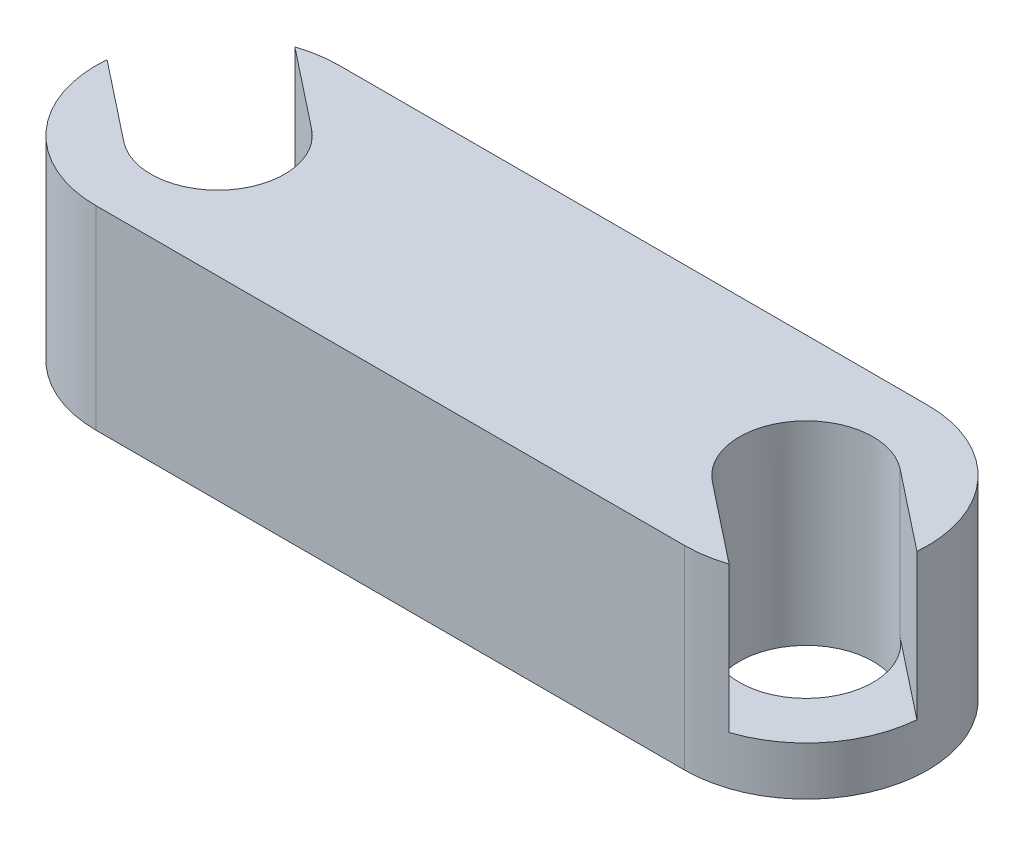
ISO-10303-21;
HEADER;
FILE_DESCRIPTION(('STEP AP214'),'2;1');
FILE_NAME('part.step','',(''),(''),'','','');
FILE_SCHEMA(('AUTOMOTIVE_DESIGN { 1 0 10303 214 1 1 1 1 }'));
ENDSEC;
DATA;
#1=APPLICATION_CONTEXT('core data for automotive mechanical design processes');
#2=APPLICATION_PROTOCOL_DEFINITION('international standard','automotive_design',2000,#1);
#3=PRODUCT_CONTEXT('',#1,'mechanical');
#4=PRODUCT('Part','Part','',(#3));
#5=PRODUCT_RELATED_PRODUCT_CATEGORY('part','',(#4));
#6=PRODUCT_DEFINITION_FORMATION('','',#4);
#7=PRODUCT_DEFINITION_CONTEXT('part definition',#1,'design');
#8=PRODUCT_DEFINITION('design','',#6,#7);
#9=PRODUCT_DEFINITION_SHAPE('','',#8);
#10=(LENGTH_UNIT() NAMED_UNIT(*) SI_UNIT(.MILLI.,.METRE.));
#11=(NAMED_UNIT(*) PLANE_ANGLE_UNIT() SI_UNIT($,.RADIAN.));
#12=(NAMED_UNIT(*) SI_UNIT($,.STERADIAN.) SOLID_ANGLE_UNIT());
#13=UNCERTAINTY_MEASURE_WITH_UNIT(LENGTH_MEASURE(1.E-05),#10,'distance_accuracy_value','');
#14=(GEOMETRIC_REPRESENTATION_CONTEXT(3) GLOBAL_UNCERTAINTY_ASSIGNED_CONTEXT((#13)) GLOBAL_UNIT_ASSIGNED_CONTEXT((#10,
#11,#12)) REPRESENTATION_CONTEXT('',''));
#15=CARTESIAN_POINT('',(0.,0.,0.));
#16=DIRECTION('',(0.,0.,1.));
#17=DIRECTION('',(1.,0.,0.));
#18=AXIS2_PLACEMENT_3D('',#15,#16,#17);
#19=CARTESIAN_POINT('',(-7.71252727608147,8.,-1.5));
#20=DIRECTION('',(0.,1.,0.));
#21=DIRECTION('',(0.,0.,1.));
#22=AXIS2_PLACEMENT_3D('',#19,#20,#21);
#23=PLANE('',#22);
#24=DIRECTION('',(0.784882765557683,0.,0.619644288548296));
#25=VECTOR('',#24,1.);
#26=CARTESIAN_POINT('',(-9.41654906958926,8.,0.658427605283628));
#27=LINE('',#26,#25);
#28=CARTESIAN_POINT('',(-12.6940807878929,8.,-1.92909743527416));
#29=VERTEX_POINT('',#28);
#30=CARTESIAN_POINT('',(-9.41654906958926,8.,0.658427605283628));
#31=VERTEX_POINT('',#30);
#32=EDGE_CURVE('E179',#29,#31,#27,.T.);
#33=ORIENTED_EDGE('',*,*,#32,.F.);
#34=CARTESIAN_POINT('',(-7.71252727608147,8.,-1.5));
#35=DIRECTION('',(0.,1.,0.));
#36=DIRECTION('',(0.,0.,1.));
#37=AXIS2_PLACEMENT_3D('',#34,#35,#36);
#38=CIRCLE('',#37,5.);
#39=CARTESIAN_POINT('',(-7.71252727608147,8.,3.5));
#40=VERTEX_POINT('',#39);
#41=EDGE_CURVE('E218',#29,#40,#38,.T.);
#42=ORIENTED_EDGE('',*,*,#41,.T.);
#43=DIRECTION('',(1.,0.,0.));
#44=VECTOR('',#43,1.);
#45=CARTESIAN_POINT('',(-7.71252727608147,8.,3.5));
#46=LINE('',#45,#44);
#47=CARTESIAN_POINT('',(16.4949095939185,8.,3.5));
#48=VERTEX_POINT('',#47);
#49=EDGE_CURVE('E217',#40,#48,#46,.T.);
#50=ORIENTED_EDGE('',*,*,#49,.T.);
#51=CARTESIAN_POINT('',(16.4949095939185,8.,-1.5));
#52=DIRECTION('',(0.,1.,0.));
#53=DIRECTION('',(0.,0.,1.));
#54=AXIS2_PLACEMENT_3D('',#51,#52,#53);
#55=CIRCLE('',#54,5.);
#56=CARTESIAN_POINT('',(18.0684195187144,8.,3.2459526458414));
#57=VERTEX_POINT('',#56);
#58=EDGE_CURVE('E222',#48,#57,#55,.T.);
#59=ORIENTED_EDGE('',*,*,#58,.T.);
#60=DIRECTION('',(0.784882765557684,0.,0.619644288548295));
#61=VECTOR('',#60,1.);
#62=CARTESIAN_POINT('',(14.7908878004107,8.,0.658427605283642));
#63=LINE('',#62,#61);
#64=CARTESIAN_POINT('',(14.7908878004107,8.,0.658427605283642));
#65=VERTEX_POINT('',#64);
#66=EDGE_CURVE('E167',#65,#57,#63,.T.);
#67=ORIENTED_EDGE('',*,*,#66,.F.);
#68=CARTESIAN_POINT('',(16.4949095939185,8.,-1.5));
#69=DIRECTION('',(0.,1.,0.));
#70=DIRECTION('',(0.,0.,1.));
#71=AXIS2_PLACEMENT_3D('',#68,#69,#70);
#72=CIRCLE('',#71,2.75);
#73=CARTESIAN_POINT('',(18.1989313874263,8.,-3.65842760528363));
#74=VERTEX_POINT('',#73);
#75=EDGE_CURVE('E199',#74,#65,#72,.T.);
#76=ORIENTED_EDGE('',*,*,#75,.F.);
#77=DIRECTION('',(-0.784882765557683,0.,-0.619644288548295));
#78=VECTOR('',#77,1.);
#79=CARTESIAN_POINT('',(18.1989313874263,8.,-3.65842760528363));
#80=LINE('',#79,#78);
#81=CARTESIAN_POINT('',(21.47646310573,8.,-1.07090256472586));
#82=VERTEX_POINT('',#81);
#83=EDGE_CURVE('E171',#82,#74,#80,.T.);
#84=ORIENTED_EDGE('',*,*,#83,.F.);
#85=CARTESIAN_POINT('',(16.4949095939185,8.,-6.5));
#86=VERTEX_POINT('',#85);
#87=EDGE_CURVE('E221',#82,#86,#55,.T.);
#88=ORIENTED_EDGE('',*,*,#87,.T.);
#89=DIRECTION('',(-1.,0.,0.));
#90=VECTOR('',#89,1.);
#91=CARTESIAN_POINT('',(-7.71252727608147,8.,-6.5));
#92=LINE('',#91,#90);
#93=CARTESIAN_POINT('',(-7.71252727608147,8.,-6.5));
#94=VERTEX_POINT('',#93);
#95=EDGE_CURVE('E226',#86,#94,#92,.T.);
#96=ORIENTED_EDGE('',*,*,#95,.T.);
#97=CARTESIAN_POINT('',(-9.28603720087728,8.,-6.24595264584141));
#98=VERTEX_POINT('',#97);
#99=EDGE_CURVE('E213',#94,#98,#38,.T.);
#100=ORIENTED_EDGE('',*,*,#99,.T.);
#101=DIRECTION('',(-0.784882765557683,0.,-0.619644288548295));
#102=VECTOR('',#101,1.);
#103=CARTESIAN_POINT('',(-6.00850548257363,8.,-3.65842760528364));
#104=LINE('',#103,#102);
#105=CARTESIAN_POINT('',(-6.00850548257363,8.,-3.65842760528364));
#106=VERTEX_POINT('',#105);
#107=EDGE_CURVE('E160',#106,#98,#104,.T.);
#108=ORIENTED_EDGE('',*,*,#107,.F.);
#109=CARTESIAN_POINT('',(-7.71252727608147,8.,-1.5));
#110=DIRECTION('',(0.,1.,0.));
#111=DIRECTION('',(0.,0.,1.));
#112=AXIS2_PLACEMENT_3D('',#109,#110,#111);
#113=CIRCLE('',#112,2.75);
#114=EDGE_CURVE('E149',#31,#106,#113,.T.);
#115=ORIENTED_EDGE('',*,*,#114,.F.);
#116=EDGE_LOOP('',(#33,#42,#50,#59,#67,#76,#84,#88,#96,#100,#108,#115));
#117=FACE_BOUND('',#116,.T.);
#118=ADVANCED_FACE('F39',(#117),#23,.T.);
#119=CARTESIAN_POINT('',(-7.71252727608147,0.,-1.5));
#120=DIRECTION('',(0.,1.,0.));
#121=DIRECTION('',(0.,0.,1.));
#122=AXIS2_PLACEMENT_3D('',#119,#120,#121);
#123=PLANE('',#122);
#124=CARTESIAN_POINT('',(-7.71252727608147,0.,-1.5));
#125=DIRECTION('',(0.,1.,0.));
#126=DIRECTION('',(0.,0.,1.));
#127=AXIS2_PLACEMENT_3D('',#124,#125,#126);
#128=CIRCLE('',#127,5.);
#129=CARTESIAN_POINT('',(-7.71252727608147,0.,-6.5));
#130=VERTEX_POINT('',#129);
#131=CARTESIAN_POINT('',(-7.71252727608147,0.,3.5));
#132=VERTEX_POINT('',#131);
#133=EDGE_CURVE('E209',#130,#132,#128,.T.);
#134=ORIENTED_EDGE('',*,*,#133,.F.);
#135=DIRECTION('',(-1.,0.,0.));
#136=VECTOR('',#135,1.);
#137=CARTESIAN_POINT('',(-7.71252727608147,0.,-6.5));
#138=LINE('',#137,#136);
#139=CARTESIAN_POINT('',(16.4949095939185,0.,-6.5));
#140=VERTEX_POINT('',#139);
#141=EDGE_CURVE('E239',#140,#130,#138,.T.);
#142=ORIENTED_EDGE('',*,*,#141,.F.);
#143=CARTESIAN_POINT('',(16.4949095939185,0.,-1.5));
#144=DIRECTION('',(0.,1.,0.));
#145=DIRECTION('',(0.,0.,1.));
#146=AXIS2_PLACEMENT_3D('',#143,#144,#145);
#147=CIRCLE('',#146,5.);
#148=CARTESIAN_POINT('',(16.4949095939185,0.,3.5));
#149=VERTEX_POINT('',#148);
#150=EDGE_CURVE('E236',#149,#140,#147,.T.);
#151=ORIENTED_EDGE('',*,*,#150,.F.);
#152=DIRECTION('',(1.,0.,0.));
#153=VECTOR('',#152,1.);
#154=CARTESIAN_POINT('',(-7.71252727608147,0.,3.5));
#155=LINE('',#154,#153);
#156=EDGE_CURVE('E233',#132,#149,#155,.T.);
#157=ORIENTED_EDGE('',*,*,#156,.F.);
#158=EDGE_LOOP('',(#134,#142,#151,#157));
#159=FACE_BOUND('',#158,.T.);
#160=CARTESIAN_POINT('',(-7.71252727608147,0.,-1.5));
#161=DIRECTION('',(0.,1.,0.));
#162=DIRECTION('',(0.,0.,1.));
#163=AXIS2_PLACEMENT_3D('',#160,#161,#162);
#164=CIRCLE('',#163,2.75);
#165=CARTESIAN_POINT('',(-7.71252727608147,0.,1.25));
#166=VERTEX_POINT('',#165);
#167=EDGE_CURVE('E203',#166,#166,#164,.T.);
#168=ORIENTED_EDGE('',*,*,#167,.T.);
#169=EDGE_LOOP('',(#168));
#170=FACE_BOUND('',#169,.T.);
#171=CARTESIAN_POINT('',(16.4949095939185,0.,-1.5));
#172=DIRECTION('',(0.,1.,0.));
#173=DIRECTION('',(0.,0.,1.));
#174=AXIS2_PLACEMENT_3D('',#171,#172,#173);
#175=CIRCLE('',#174,2.75);
#176=CARTESIAN_POINT('',(16.4949095939185,0.,1.25));
#177=VERTEX_POINT('',#176);
#178=EDGE_CURVE('E198',#177,#177,#175,.T.);
#179=ORIENTED_EDGE('',*,*,#178,.T.);
#180=EDGE_LOOP('',(#179));
#181=FACE_BOUND('',#180,.T.);
#182=ADVANCED_FACE('F286',(#159,#170,#181),#123,.F.);
#183=CARTESIAN_POINT('',(-7.71252727608147,8.,-1.5));
#184=DIRECTION('',(0.,-1.,0.));
#185=DIRECTION('',(0.,0.,-1.));
#186=AXIS2_PLACEMENT_3D('',#183,#184,#185);
#187=CYLINDRICAL_SURFACE('',#186,5.);
#188=ORIENTED_EDGE('',*,*,#41,.F.);
#189=DIRECTION('',(0.,-1.,0.));
#190=VECTOR('',#189,1.);
#191=CARTESIAN_POINT('',(-12.6940807878929,8.,-1.92909743527416));
#192=LINE('',#191,#190);
#193=CARTESIAN_POINT('',(-12.6940807878929,2.,-1.92909743527416));
#194=VERTEX_POINT('',#193);
#195=EDGE_CURVE('E194',#29,#194,#192,.T.);
#196=ORIENTED_EDGE('',*,*,#195,.T.);
#197=CARTESIAN_POINT('',(-7.71252727608147,2.,-1.5));
#198=DIRECTION('',(0.,-1.,0.));
#199=DIRECTION('',(0.,0.,-1.));
#200=AXIS2_PLACEMENT_3D('',#197,#198,#199);
#201=CIRCLE('',#200,5.);
#202=CARTESIAN_POINT('',(-9.28603720087728,2.,-6.24595264584141));
#203=VERTEX_POINT('',#202);
#204=EDGE_CURVE('E189',#194,#203,#201,.T.);
#205=ORIENTED_EDGE('',*,*,#204,.T.);
#206=DIRECTION('',(0.,-1.,0.));
#207=VECTOR('',#206,1.);
#208=CARTESIAN_POINT('',(-9.28603720087728,8.,-6.24595264584141));
#209=LINE('',#208,#207);
#210=EDGE_CURVE('E142',#203,#98,#209,.F.);
#211=ORIENTED_EDGE('',*,*,#210,.T.);
#212=ORIENTED_EDGE('',*,*,#99,.F.);
#213=DIRECTION('',(0.,-1.,0.));
#214=VECTOR('',#213,1.);
#215=CARTESIAN_POINT('',(-7.71252727608147,8.,-6.5));
#216=LINE('',#215,#214);
#217=EDGE_CURVE('E229',#94,#130,#216,.T.);
#218=ORIENTED_EDGE('',*,*,#217,.T.);
#219=ORIENTED_EDGE('',*,*,#133,.T.);
#220=DIRECTION('',(0.,-1.,0.));
#221=VECTOR('',#220,1.);
#222=CARTESIAN_POINT('',(-7.71252727608147,8.,3.5));
#223=LINE('',#222,#221);
#224=EDGE_CURVE('E253',#40,#132,#223,.T.);
#225=ORIENTED_EDGE('',*,*,#224,.F.);
#226=EDGE_LOOP('',(#188,#196,#205,#211,#212,#218,#219,#225));
#227=FACE_BOUND('',#226,.T.);
#228=ADVANCED_FACE('F41',(#227),#187,.T.);
#229=CARTESIAN_POINT('',(-7.71252727608147,8.,3.5));
#230=DIRECTION('',(0.,0.,-1.));
#231=DIRECTION('',(-1.,0.,0.));
#232=AXIS2_PLACEMENT_3D('',#229,#230,#231);
#233=PLANE('',#232);
#234=ORIENTED_EDGE('',*,*,#156,.T.);
#235=DIRECTION('',(0.,-1.,0.));
#236=VECTOR('',#235,1.);
#237=CARTESIAN_POINT('',(16.4949095939185,8.,3.5));
#238=LINE('',#237,#236);
#239=EDGE_CURVE('E249',#48,#149,#238,.T.);
#240=ORIENTED_EDGE('',*,*,#239,.F.);
#241=ORIENTED_EDGE('',*,*,#49,.F.);
#242=ORIENTED_EDGE('',*,*,#224,.T.);
#243=EDGE_LOOP('',(#234,#240,#241,#242));
#244=FACE_BOUND('',#243,.T.);
#245=ADVANCED_FACE('F300',(#244),#233,.F.);
#246=CARTESIAN_POINT('',(16.4949095939185,8.,-1.5));
#247=DIRECTION('',(0.,-1.,0.));
#248=DIRECTION('',(0.,0.,-1.));
#249=AXIS2_PLACEMENT_3D('',#246,#247,#248);
#250=CYLINDRICAL_SURFACE('',#249,5.);
#251=ORIENTED_EDGE('',*,*,#87,.F.);
#252=DIRECTION('',(0.,-1.,0.));
#253=VECTOR('',#252,1.);
#254=CARTESIAN_POINT('',(21.47646310573,8.,-1.07090256472586));
#255=LINE('',#254,#253);
#256=CARTESIAN_POINT('',(21.47646310573,2.,-1.07090256472586));
#257=VERTEX_POINT('',#256);
#258=EDGE_CURVE('E185',#82,#257,#255,.T.);
#259=ORIENTED_EDGE('',*,*,#258,.T.);
#260=CARTESIAN_POINT('',(16.4949095939185,2.,-1.5));
#261=DIRECTION('',(0.,-1.,0.));
#262=DIRECTION('',(0.,0.,-1.));
#263=AXIS2_PLACEMENT_3D('',#260,#261,#262);
#264=CIRCLE('',#263,5.);
#265=CARTESIAN_POINT('',(18.0684195187144,2.,3.2459526458414));
#266=VERTEX_POINT('',#265);
#267=EDGE_CURVE('E151',#257,#266,#264,.T.);
#268=ORIENTED_EDGE('',*,*,#267,.T.);
#269=DIRECTION('',(0.,-1.,0.));
#270=VECTOR('',#269,1.);
#271=CARTESIAN_POINT('',(18.0684195187144,8.,3.2459526458414));
#272=LINE('',#271,#270);
#273=EDGE_CURVE('E156',#266,#57,#272,.F.);
#274=ORIENTED_EDGE('',*,*,#273,.T.);
#275=ORIENTED_EDGE('',*,*,#58,.F.);
#276=ORIENTED_EDGE('',*,*,#239,.T.);
#277=ORIENTED_EDGE('',*,*,#150,.T.);
#278=DIRECTION('',(0.,-1.,0.));
#279=VECTOR('',#278,1.);
#280=CARTESIAN_POINT('',(16.4949095939185,8.,-6.5));
#281=LINE('',#280,#279);
#282=EDGE_CURVE('E245',#86,#140,#281,.T.);
#283=ORIENTED_EDGE('',*,*,#282,.F.);
#284=EDGE_LOOP('',(#251,#259,#268,#274,#275,#276,#277,#283));
#285=FACE_BOUND('',#284,.T.);
#286=ADVANCED_FACE('F275',(#285),#250,.T.);
#287=CARTESIAN_POINT('',(-7.71252727608147,8.,-6.5));
#288=DIRECTION('',(0.,0.,1.));
#289=DIRECTION('',(1.,0.,0.));
#290=AXIS2_PLACEMENT_3D('',#287,#288,#289);
#291=PLANE('',#290);
#292=ORIENTED_EDGE('',*,*,#141,.T.);
#293=ORIENTED_EDGE('',*,*,#217,.F.);
#294=ORIENTED_EDGE('',*,*,#95,.F.);
#295=ORIENTED_EDGE('',*,*,#282,.T.);
#296=EDGE_LOOP('',(#292,#293,#294,#295));
#297=FACE_BOUND('',#296,.T.);
#298=ADVANCED_FACE('F295',(#297),#291,.F.);
#299=CARTESIAN_POINT('',(-7.71252727608147,8.,-1.5));
#300=DIRECTION('',(0.,-1.,0.));
#301=DIRECTION('',(0.,0.,-1.));
#302=AXIS2_PLACEMENT_3D('',#299,#300,#301);
#303=CYLINDRICAL_SURFACE('',#302,2.75);
#304=DIRECTION('',(0.,1.,0.));
#305=VECTOR('',#304,1.);
#306=CARTESIAN_POINT('',(-9.41654906958926,2.,0.658427605283628));
#307=LINE('',#306,#305);
#308=CARTESIAN_POINT('',(-9.41654906958927,2.,0.658427605283636));
#309=VERTEX_POINT('',#308);
#310=EDGE_CURVE('E55',#309,#31,#307,.T.);
#311=ORIENTED_EDGE('',*,*,#310,.T.);
#312=ORIENTED_EDGE('',*,*,#114,.T.);
#313=DIRECTION('',(0.,1.,0.));
#314=VECTOR('',#313,1.);
#315=CARTESIAN_POINT('',(-6.00850548257363,2.,-3.65842760528364));
#316=LINE('',#315,#314);
#317=CARTESIAN_POINT('',(-6.00850548257363,2.,-3.65842760528364));
#318=VERTEX_POINT('',#317);
#319=EDGE_CURVE('E139',#318,#106,#316,.T.);
#320=ORIENTED_EDGE('',*,*,#319,.F.);
#321=CARTESIAN_POINT('',(-7.71252727608147,2.,-1.5));
#322=DIRECTION('',(0.,-1.,0.));
#323=DIRECTION('',(0.,0.,-1.));
#324=AXIS2_PLACEMENT_3D('',#321,#322,#323);
#325=CIRCLE('',#324,2.75);
#326=EDGE_CURVE('E11',#309,#318,#325,.T.);
#327=ORIENTED_EDGE('',*,*,#326,.F.);
#328=EDGE_LOOP('',(#311,#312,#320,#327));
#329=FACE_BOUND('',#328,.T.);
#330=ORIENTED_EDGE('',*,*,#167,.F.);
#331=EDGE_LOOP('',(#330));
#332=FACE_BOUND('',#331,.T.);
#333=ADVANCED_FACE('F146',(#329,#332),#303,.F.);
#334=CARTESIAN_POINT('',(16.4949095939185,8.,-1.5));
#335=DIRECTION('',(0.,-1.,0.));
#336=DIRECTION('',(0.,0.,-1.));
#337=AXIS2_PLACEMENT_3D('',#334,#335,#336);
#338=CYLINDRICAL_SURFACE('',#337,2.75);
#339=DIRECTION('',(0.,1.,0.));
#340=VECTOR('',#339,1.);
#341=CARTESIAN_POINT('',(18.1989313874263,2.,-3.65842760528363));
#342=LINE('',#341,#340);
#343=CARTESIAN_POINT('',(18.1989313874263,2.,-3.65842760528363));
#344=VERTEX_POINT('',#343);
#345=EDGE_CURVE('E63',#344,#74,#342,.T.);
#346=ORIENTED_EDGE('',*,*,#345,.T.);
#347=ORIENTED_EDGE('',*,*,#75,.T.);
#348=DIRECTION('',(0.,1.,0.));
#349=VECTOR('',#348,1.);
#350=CARTESIAN_POINT('',(14.7908878004107,2.,0.658427605283642));
#351=LINE('',#350,#349);
#352=CARTESIAN_POINT('',(14.7908878004107,2.,0.658427605283642));
#353=VERTEX_POINT('',#352);
#354=EDGE_CURVE('E176',#353,#65,#351,.T.);
#355=ORIENTED_EDGE('',*,*,#354,.F.);
#356=CARTESIAN_POINT('',(16.4949095939185,2.,-1.5));
#357=DIRECTION('',(0.,-1.,0.));
#358=DIRECTION('',(0.,0.,-1.));
#359=AXIS2_PLACEMENT_3D('',#356,#357,#358);
#360=CIRCLE('',#359,2.75);
#361=EDGE_CURVE('E48',#344,#353,#360,.T.);
#362=ORIENTED_EDGE('',*,*,#361,.F.);
#363=EDGE_LOOP('',(#346,#347,#355,#362));
#364=FACE_BOUND('',#363,.T.);
#365=ORIENTED_EDGE('',*,*,#178,.F.);
#366=EDGE_LOOP('',(#365));
#367=FACE_BOUND('',#366,.T.);
#368=ADVANCED_FACE('F266',(#364,#367),#338,.F.);
#369=CARTESIAN_POINT('',(18.1989313874263,2.,-3.65842760528363));
#370=DIRECTION('',(0.619644288548295,0.,-0.784882765557684));
#371=DIRECTION('',(-0.784882765557684,0.,-0.619644288548295));
#372=AXIS2_PLACEMENT_3D('',#369,#370,#371);
#373=PLANE('',#372);
#374=ORIENTED_EDGE('',*,*,#83,.T.);
#375=ORIENTED_EDGE('',*,*,#345,.F.);
#376=DIRECTION('',(-0.784882765557683,0.,-0.619644288548295));
#377=VECTOR('',#376,1.);
#378=CARTESIAN_POINT('',(18.1989313874263,2.,-3.65842760528363));
#379=LINE('',#378,#377);
#380=EDGE_CURVE('E163',#257,#344,#379,.T.);
#381=ORIENTED_EDGE('',*,*,#380,.F.);
#382=ORIENTED_EDGE('',*,*,#258,.F.);
#383=EDGE_LOOP('',(#374,#375,#381,#382));
#384=FACE_BOUND('',#383,.T.);
#385=ADVANCED_FACE('F276',(#384),#373,.F.);
#386=CARTESIAN_POINT('',(14.7908878004107,2.,0.658427605283642));
#387=DIRECTION('',(-0.619644288548295,0.,0.784882765557684));
#388=DIRECTION('',(0.784882765557684,0.,0.619644288548295));
#389=AXIS2_PLACEMENT_3D('',#386,#387,#388);
#390=PLANE('',#389);
#391=DIRECTION('',(0.784882765557684,0.,0.619644288548295));
#392=VECTOR('',#391,1.);
#393=CARTESIAN_POINT('',(14.7908878004107,2.,0.658427605283642));
#394=LINE('',#393,#392);
#395=EDGE_CURVE('E166',#353,#266,#394,.T.);
#396=ORIENTED_EDGE('',*,*,#395,.F.);
#397=ORIENTED_EDGE('',*,*,#354,.T.);
#398=ORIENTED_EDGE('',*,*,#66,.T.);
#399=ORIENTED_EDGE('',*,*,#273,.F.);
#400=EDGE_LOOP('',(#396,#397,#398,#399));
#401=FACE_BOUND('',#400,.T.);
#402=ADVANCED_FACE('F264',(#401),#390,.F.);
#403=CARTESIAN_POINT('',(0.,2.,0.));
#404=DIRECTION('',(0.,-1.,0.));
#405=DIRECTION('',(0.,0.,-1.));
#406=AXIS2_PLACEMENT_3D('',#403,#404,#405);
#407=PLANE('',#406);
#408=ORIENTED_EDGE('',*,*,#380,.T.);
#409=ORIENTED_EDGE('',*,*,#361,.T.);
#410=ORIENTED_EDGE('',*,*,#395,.T.);
#411=ORIENTED_EDGE('',*,*,#267,.F.);
#412=EDGE_LOOP('',(#408,#409,#410,#411));
#413=FACE_BOUND('',#412,.T.);
#414=ADVANCED_FACE('F260',(#413),#407,.F.);
#415=CARTESIAN_POINT('',(-9.41654906958926,2.,0.658427605283628));
#416=DIRECTION('',(-0.619644288548296,0.,0.784882765557683));
#417=DIRECTION('',(0.784882765557683,0.,0.619644288548296));
#418=AXIS2_PLACEMENT_3D('',#415,#416,#417);
#419=PLANE('',#418);
#420=ORIENTED_EDGE('',*,*,#32,.T.);
#421=ORIENTED_EDGE('',*,*,#310,.F.);
#422=DIRECTION('',(0.784882765557683,0.,0.619644288548296));
#423=VECTOR('',#422,1.);
#424=CARTESIAN_POINT('',(-9.41654906958926,2.,0.658427605283628));
#425=LINE('',#424,#423);
#426=EDGE_CURVE('E134',#194,#309,#425,.T.);
#427=ORIENTED_EDGE('',*,*,#426,.F.);
#428=ORIENTED_EDGE('',*,*,#195,.F.);
#429=EDGE_LOOP('',(#420,#421,#427,#428));
#430=FACE_BOUND('',#429,.T.);
#431=ADVANCED_FACE('F321',(#430),#419,.F.);
#432=CARTESIAN_POINT('',(-6.00850548257363,2.,-3.65842760528364));
#433=DIRECTION('',(0.619644288548296,0.,-0.784882765557683));
#434=DIRECTION('',(-0.784882765557683,0.,-0.619644288548296));
#435=AXIS2_PLACEMENT_3D('',#432,#433,#434);
#436=PLANE('',#435);
#437=DIRECTION('',(-0.784882765557683,0.,-0.619644288548295));
#438=VECTOR('',#437,1.);
#439=CARTESIAN_POINT('',(-6.00850548257363,2.,-3.65842760528364));
#440=LINE('',#439,#438);
#441=EDGE_CURVE('E132',#318,#203,#440,.T.);
#442=ORIENTED_EDGE('',*,*,#441,.F.);
#443=ORIENTED_EDGE('',*,*,#319,.T.);
#444=ORIENTED_EDGE('',*,*,#107,.T.);
#445=ORIENTED_EDGE('',*,*,#210,.F.);
#446=EDGE_LOOP('',(#442,#443,#444,#445));
#447=FACE_BOUND('',#446,.T.);
#448=ADVANCED_FACE('F138',(#447),#436,.F.);
#449=CARTESIAN_POINT('',(0.,2.,0.));
#450=DIRECTION('',(0.,-1.,0.));
#451=DIRECTION('',(0.,0.,-1.));
#452=AXIS2_PLACEMENT_3D('',#449,#450,#451);
#453=PLANE('',#452);
#454=ORIENTED_EDGE('',*,*,#426,.T.);
#455=ORIENTED_EDGE('',*,*,#326,.T.);
#456=ORIENTED_EDGE('',*,*,#441,.T.);
#457=ORIENTED_EDGE('',*,*,#204,.F.);
#458=EDGE_LOOP('',(#454,#455,#456,#457));
#459=FACE_BOUND('',#458,.T.);
#460=ADVANCED_FACE('F131',(#459),#453,.F.);
#461=CLOSED_SHELL('',(#118,#182,#228,#245,#286,#298,#333,#368,#385,#402,#414,#431,#448,#460));
#462=MANIFOLD_SOLID_BREP('B2',#461);
#463=ADVANCED_BREP_SHAPE_REPRESENTATION('',(#18,#462),#14);
#464=SHAPE_DEFINITION_REPRESENTATION(#9,#463);
ENDSEC;
END-ISO-10303-21;
